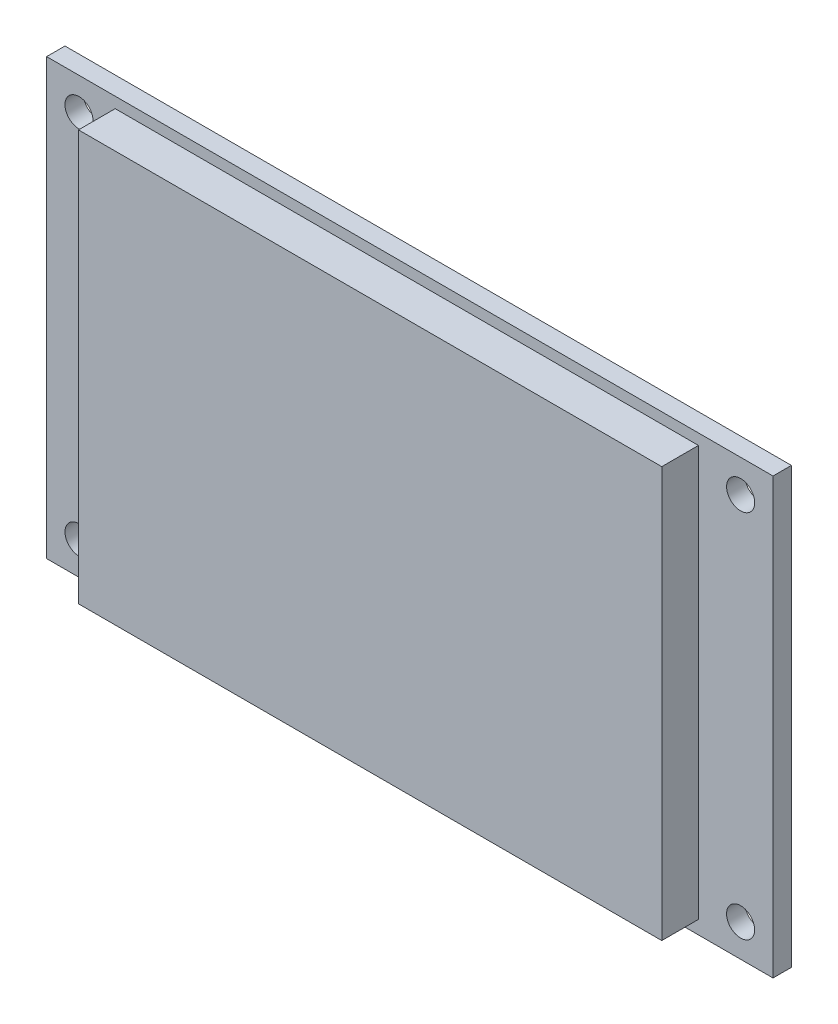
ISO-10303-21;
HEADER;
FILE_DESCRIPTION(('STEP AP214'),'2;1');
FILE_NAME('part.step','',(''),(''),'','','');
FILE_SCHEMA(('AUTOMOTIVE_DESIGN { 1 0 10303 214 1 1 1 1 }'));
ENDSEC;
DATA;
#1=APPLICATION_CONTEXT('core data for automotive mechanical design processes');
#2=APPLICATION_PROTOCOL_DEFINITION('international standard','automotive_design',2000,#1);
#3=PRODUCT_CONTEXT('',#1,'mechanical');
#4=PRODUCT('Part','Part','',(#3));
#5=PRODUCT_RELATED_PRODUCT_CATEGORY('part','',(#4));
#6=PRODUCT_DEFINITION_FORMATION('','',#4);
#7=PRODUCT_DEFINITION_CONTEXT('part definition',#1,'design');
#8=PRODUCT_DEFINITION('design','',#6,#7);
#9=PRODUCT_DEFINITION_SHAPE('','',#8);
#10=(LENGTH_UNIT() NAMED_UNIT(*) SI_UNIT(.MILLI.,.METRE.));
#11=(NAMED_UNIT(*) PLANE_ANGLE_UNIT() SI_UNIT($,.RADIAN.));
#12=(NAMED_UNIT(*) SI_UNIT($,.STERADIAN.) SOLID_ANGLE_UNIT());
#13=UNCERTAINTY_MEASURE_WITH_UNIT(LENGTH_MEASURE(1.E-05),#10,'distance_accuracy_value','');
#14=(GEOMETRIC_REPRESENTATION_CONTEXT(3) GLOBAL_UNCERTAINTY_ASSIGNED_CONTEXT((#13)) GLOBAL_UNIT_ASSIGNED_CONTEXT((#10,
#11,#12)) REPRESENTATION_CONTEXT('',''));
#15=CARTESIAN_POINT('',(0.,0.,0.));
#16=DIRECTION('',(0.,0.,1.));
#17=DIRECTION('',(1.,0.,0.));
#18=AXIS2_PLACEMENT_3D('',#15,#16,#17);
#19=CARTESIAN_POINT('',(0.,0.,1.7));
#20=DIRECTION('',(0.,0.,-1.));
#21=DIRECTION('',(-1.,0.,0.));
#22=AXIS2_PLACEMENT_3D('',#19,#20,#21);
#23=PLANE('',#22);
#24=CARTESIAN_POINT('',(-30.625,17.125,1.7));
#25=DIRECTION('',(0.,0.,1.));
#26=DIRECTION('',(1.,0.,0.));
#27=AXIS2_PLACEMENT_3D('',#24,#25,#26);
#28=CIRCLE('',#27,1.29999999999999);
#29=CARTESIAN_POINT('',(-29.325,17.125,1.7));
#30=VERTEX_POINT('',#29);
#31=EDGE_CURVE('E310',#30,#30,#28,.T.);
#32=ORIENTED_EDGE('',*,*,#31,.F.);
#33=EDGE_LOOP('',(#32));
#34=FACE_BOUND('',#33,.T.);
#35=CARTESIAN_POINT('',(-30.625,-17.125,1.7));
#36=DIRECTION('',(0.,0.,1.));
#37=DIRECTION('',(1.,0.,0.));
#38=AXIS2_PLACEMENT_3D('',#35,#36,#37);
#39=CIRCLE('',#38,1.29999999999999);
#40=CARTESIAN_POINT('',(-29.325,-17.125,1.7));
#41=VERTEX_POINT('',#40);
#42=EDGE_CURVE('E312',#41,#41,#39,.T.);
#43=ORIENTED_EDGE('',*,*,#42,.F.);
#44=EDGE_LOOP('',(#43));
#45=FACE_BOUND('',#44,.T.);
#46=CARTESIAN_POINT('',(30.625,-17.125,1.7));
#47=DIRECTION('',(0.,0.,1.));
#48=DIRECTION('',(1.,0.,0.));
#49=AXIS2_PLACEMENT_3D('',#46,#47,#48);
#50=CIRCLE('',#49,1.29999999999999);
#51=CARTESIAN_POINT('',(31.925,-17.125,1.7));
#52=VERTEX_POINT('',#51);
#53=EDGE_CURVE('E320',#52,#52,#50,.T.);
#54=ORIENTED_EDGE('',*,*,#53,.F.);
#55=EDGE_LOOP('',(#54));
#56=FACE_BOUND('',#55,.T.);
#57=CARTESIAN_POINT('',(30.625,17.125,1.7));
#58=DIRECTION('',(0.,0.,1.));
#59=DIRECTION('',(1.,0.,0.));
#60=AXIS2_PLACEMENT_3D('',#57,#58,#59);
#61=CIRCLE('',#60,1.29999999999999);
#62=CARTESIAN_POINT('',(31.925,17.125,1.7));
#63=VERTEX_POINT('',#62);
#64=EDGE_CURVE('E326',#63,#63,#61,.T.);
#65=ORIENTED_EDGE('',*,*,#64,.F.);
#66=EDGE_LOOP('',(#65));
#67=FACE_BOUND('',#66,.T.);
#68=DIRECTION('',(0.,1.,0.));
#69=VECTOR('',#68,1.);
#70=CARTESIAN_POINT('',(33.625,-20.125,1.7));
#71=LINE('',#70,#69);
#72=CARTESIAN_POINT('',(33.625,-20.125,1.7));
#73=VERTEX_POINT('',#72);
#74=CARTESIAN_POINT('',(33.625,20.125,1.7));
#75=VERTEX_POINT('',#74);
#76=EDGE_CURVE('E131',#73,#75,#71,.T.);
#77=ORIENTED_EDGE('',*,*,#76,.T.);
#78=DIRECTION('',(-1.,0.,0.));
#79=VECTOR('',#78,1.);
#80=CARTESIAN_POINT('',(-33.625,20.125,1.7));
#81=LINE('',#80,#79);
#82=CARTESIAN_POINT('',(-33.625,20.125,1.7));
#83=VERTEX_POINT('',#82);
#84=EDGE_CURVE('E134',#75,#83,#81,.T.);
#85=ORIENTED_EDGE('',*,*,#84,.T.);
#86=DIRECTION('',(0.,-1.,0.));
#87=VECTOR('',#86,1.);
#88=CARTESIAN_POINT('',(-33.625,-20.125,1.7));
#89=LINE('',#88,#87);
#90=CARTESIAN_POINT('',(-33.625,-20.125,1.7));
#91=VERTEX_POINT('',#90);
#92=EDGE_CURVE('E137',#83,#91,#89,.T.);
#93=ORIENTED_EDGE('',*,*,#92,.T.);
#94=DIRECTION('',(1.,0.,0.));
#95=VECTOR('',#94,1.);
#96=CARTESIAN_POINT('',(-33.625,-20.125,1.7));
#97=LINE('',#96,#95);
#98=EDGE_CURVE('E139',#91,#73,#97,.T.);
#99=ORIENTED_EDGE('',*,*,#98,.T.);
#100=EDGE_LOOP('',(#77,#85,#93,#99));
#101=FACE_BOUND('',#100,.T.);
#102=DIRECTION('',(0.,1.,0.));
#103=VECTOR('',#102,1.);
#104=CARTESIAN_POINT('',(26.725,-18.875,1.7));
#105=LINE('',#104,#103);
#106=CARTESIAN_POINT('',(26.725,-18.875,1.7));
#107=VERTEX_POINT('',#106);
#108=CARTESIAN_POINT('',(26.725,19.125,1.7));
#109=VERTEX_POINT('',#108);
#110=EDGE_CURVE('E52',#107,#109,#105,.T.);
#111=ORIENTED_EDGE('',*,*,#110,.F.);
#112=DIRECTION('',(1.,0.,0.));
#113=VECTOR('',#112,1.);
#114=CARTESIAN_POINT('',(-27.275,-18.875,1.7));
#115=LINE('',#114,#113);
#116=CARTESIAN_POINT('',(-27.275,-18.875,1.7));
#117=VERTEX_POINT('',#116);
#118=EDGE_CURVE('E56',#117,#107,#115,.T.);
#119=ORIENTED_EDGE('',*,*,#118,.F.);
#120=DIRECTION('',(0.,-1.,0.));
#121=VECTOR('',#120,1.);
#122=CARTESIAN_POINT('',(-27.275,-18.875,1.7));
#123=LINE('',#122,#121);
#124=CARTESIAN_POINT('',(-27.275,19.125,1.7));
#125=VERTEX_POINT('',#124);
#126=EDGE_CURVE('E338',#125,#117,#123,.T.);
#127=ORIENTED_EDGE('',*,*,#126,.F.);
#128=DIRECTION('',(-1.,0.,0.));
#129=VECTOR('',#128,1.);
#130=CARTESIAN_POINT('',(-27.275,19.125,1.7));
#131=LINE('',#130,#129);
#132=EDGE_CURVE('E336',#109,#125,#131,.T.);
#133=ORIENTED_EDGE('',*,*,#132,.F.);
#134=EDGE_LOOP('',(#111,#119,#127,#133));
#135=FACE_BOUND('',#134,.T.);
#136=ADVANCED_FACE('F37',(#34,#45,#56,#67,#101,#135),#23,.F.);
#137=CARTESIAN_POINT('',(33.625,-20.125,1.7));
#138=DIRECTION('',(-1.,0.,0.));
#139=DIRECTION('',(0.,0.,1.));
#140=AXIS2_PLACEMENT_3D('',#137,#138,#139);
#141=PLANE('',#140);
#142=DIRECTION('',(0.,1.,0.));
#143=VECTOR('',#142,1.);
#144=CARTESIAN_POINT('',(33.625,-20.125,0.));
#145=LINE('',#144,#143);
#146=CARTESIAN_POINT('',(33.625,-20.125,0.));
#147=VERTEX_POINT('',#146);
#148=CARTESIAN_POINT('',(33.625,20.125,0.));
#149=VERTEX_POINT('',#148);
#150=EDGE_CURVE('E122',#147,#149,#145,.T.);
#151=ORIENTED_EDGE('',*,*,#150,.T.);
#152=DIRECTION('',(0.,0.,-1.));
#153=VECTOR('',#152,1.);
#154=CARTESIAN_POINT('',(33.625,20.125,1.7));
#155=LINE('',#154,#153);
#156=EDGE_CURVE('E11',#75,#149,#155,.T.);
#157=ORIENTED_EDGE('',*,*,#156,.F.);
#158=ORIENTED_EDGE('',*,*,#76,.F.);
#159=DIRECTION('',(0.,0.,-1.));
#160=VECTOR('',#159,1.);
#161=CARTESIAN_POINT('',(33.625,-20.125,1.7));
#162=LINE('',#161,#160);
#163=EDGE_CURVE('E140',#73,#147,#162,.T.);
#164=ORIENTED_EDGE('',*,*,#163,.T.);
#165=EDGE_LOOP('',(#151,#157,#158,#164));
#166=FACE_BOUND('',#165,.T.);
#167=ADVANCED_FACE('F39',(#166),#141,.F.);
#168=CARTESIAN_POINT('',(-33.625,20.125,1.7));
#169=DIRECTION('',(0.,-1.,0.));
#170=DIRECTION('',(0.,0.,-1.));
#171=AXIS2_PLACEMENT_3D('',#168,#169,#170);
#172=PLANE('',#171);
#173=DIRECTION('',(-1.,0.,0.));
#174=VECTOR('',#173,1.);
#175=CARTESIAN_POINT('',(-33.625,20.125,0.));
#176=LINE('',#175,#174);
#177=CARTESIAN_POINT('',(-33.625,20.125,0.));
#178=VERTEX_POINT('',#177);
#179=EDGE_CURVE('E125',#149,#178,#176,.T.);
#180=ORIENTED_EDGE('',*,*,#179,.T.);
#181=DIRECTION('',(0.,0.,-1.));
#182=VECTOR('',#181,1.);
#183=CARTESIAN_POINT('',(-33.625,20.125,1.7));
#184=LINE('',#183,#182);
#185=EDGE_CURVE('E45',#83,#178,#184,.T.);
#186=ORIENTED_EDGE('',*,*,#185,.F.);
#187=ORIENTED_EDGE('',*,*,#84,.F.);
#188=ORIENTED_EDGE('',*,*,#156,.T.);
#189=EDGE_LOOP('',(#180,#186,#187,#188));
#190=FACE_BOUND('',#189,.T.);
#191=ADVANCED_FACE('F170',(#190),#172,.F.);
#192=CARTESIAN_POINT('',(-33.625,-20.125,1.7));
#193=DIRECTION('',(1.,0.,0.));
#194=DIRECTION('',(0.,0.,-1.));
#195=AXIS2_PLACEMENT_3D('',#192,#193,#194);
#196=PLANE('',#195);
#197=DIRECTION('',(0.,-1.,0.));
#198=VECTOR('',#197,1.);
#199=CARTESIAN_POINT('',(-33.625,-20.125,0.));
#200=LINE('',#199,#198);
#201=CARTESIAN_POINT('',(-33.625,-20.125,0.));
#202=VERTEX_POINT('',#201);
#203=EDGE_CURVE('E143',#178,#202,#200,.T.);
#204=ORIENTED_EDGE('',*,*,#203,.T.);
#205=DIRECTION('',(0.,0.,-1.));
#206=VECTOR('',#205,1.);
#207=CARTESIAN_POINT('',(-33.625,-20.125,1.7));
#208=LINE('',#207,#206);
#209=EDGE_CURVE('E148',#91,#202,#208,.T.);
#210=ORIENTED_EDGE('',*,*,#209,.F.);
#211=ORIENTED_EDGE('',*,*,#92,.F.);
#212=ORIENTED_EDGE('',*,*,#185,.T.);
#213=EDGE_LOOP('',(#204,#210,#211,#212));
#214=FACE_BOUND('',#213,.T.);
#215=ADVANCED_FACE('F155',(#214),#196,.F.);
#216=CARTESIAN_POINT('',(-33.625,-20.125,1.7));
#217=DIRECTION('',(0.,1.,0.));
#218=DIRECTION('',(0.,0.,1.));
#219=AXIS2_PLACEMENT_3D('',#216,#217,#218);
#220=PLANE('',#219);
#221=DIRECTION('',(1.,0.,0.));
#222=VECTOR('',#221,1.);
#223=CARTESIAN_POINT('',(-33.625,-20.125,0.));
#224=LINE('',#223,#222);
#225=EDGE_CURVE('E135',#202,#147,#224,.T.);
#226=ORIENTED_EDGE('',*,*,#225,.T.);
#227=ORIENTED_EDGE('',*,*,#163,.F.);
#228=ORIENTED_EDGE('',*,*,#98,.F.);
#229=ORIENTED_EDGE('',*,*,#209,.T.);
#230=EDGE_LOOP('',(#226,#227,#228,#229));
#231=FACE_BOUND('',#230,.T.);
#232=ADVANCED_FACE('F164',(#231),#220,.F.);
#233=CARTESIAN_POINT('',(0.,0.,0.));
#234=DIRECTION('',(0.,0.,-1.));
#235=DIRECTION('',(-1.,0.,0.));
#236=AXIS2_PLACEMENT_3D('',#233,#234,#235);
#237=PLANE('',#236);
#238=CARTESIAN_POINT('',(-30.625,17.125,0.));
#239=DIRECTION('',(0.,0.,1.));
#240=DIRECTION('',(1.,0.,0.));
#241=AXIS2_PLACEMENT_3D('',#238,#239,#240);
#242=CIRCLE('',#241,1.3);
#243=CARTESIAN_POINT('',(-29.325,17.125,0.));
#244=VERTEX_POINT('',#243);
#245=EDGE_CURVE('E308',#244,#244,#242,.T.);
#246=ORIENTED_EDGE('',*,*,#245,.T.);
#247=EDGE_LOOP('',(#246));
#248=FACE_BOUND('',#247,.T.);
#249=CARTESIAN_POINT('',(-30.625,-17.125,0.));
#250=DIRECTION('',(0.,0.,1.));
#251=DIRECTION('',(1.,0.,0.));
#252=AXIS2_PLACEMENT_3D('',#249,#250,#251);
#253=CIRCLE('',#252,1.3);
#254=CARTESIAN_POINT('',(-29.325,-17.125,0.));
#255=VERTEX_POINT('',#254);
#256=EDGE_CURVE('E317',#255,#255,#253,.T.);
#257=ORIENTED_EDGE('',*,*,#256,.T.);
#258=EDGE_LOOP('',(#257));
#259=FACE_BOUND('',#258,.T.);
#260=CARTESIAN_POINT('',(30.625,-17.125,0.));
#261=DIRECTION('',(0.,0.,1.));
#262=DIRECTION('',(1.,0.,0.));
#263=AXIS2_PLACEMENT_3D('',#260,#261,#262);
#264=CIRCLE('',#263,1.3);
#265=CARTESIAN_POINT('',(31.925,-17.125,0.));
#266=VERTEX_POINT('',#265);
#267=EDGE_CURVE('E323',#266,#266,#264,.T.);
#268=ORIENTED_EDGE('',*,*,#267,.T.);
#269=EDGE_LOOP('',(#268));
#270=FACE_BOUND('',#269,.T.);
#271=CARTESIAN_POINT('',(30.625,17.125,0.));
#272=DIRECTION('',(0.,0.,1.));
#273=DIRECTION('',(1.,0.,0.));
#274=AXIS2_PLACEMENT_3D('',#271,#272,#273);
#275=CIRCLE('',#274,1.3);
#276=CARTESIAN_POINT('',(31.925,17.125,0.));
#277=VERTEX_POINT('',#276);
#278=EDGE_CURVE('E329',#277,#277,#275,.T.);
#279=ORIENTED_EDGE('',*,*,#278,.T.);
#280=EDGE_LOOP('',(#279));
#281=FACE_BOUND('',#280,.T.);
#282=ORIENTED_EDGE('',*,*,#150,.F.);
#283=ORIENTED_EDGE('',*,*,#225,.F.);
#284=ORIENTED_EDGE('',*,*,#203,.F.);
#285=ORIENTED_EDGE('',*,*,#179,.F.);
#286=EDGE_LOOP('',(#282,#283,#284,#285));
#287=FACE_BOUND('',#286,.T.);
#288=ADVANCED_FACE('F161',(#248,#259,#270,#281,#287),#237,.T.);
#289=CARTESIAN_POINT('',(26.725,-18.875,5.1));
#290=DIRECTION('',(-1.,0.,0.));
#291=DIRECTION('',(0.,0.,1.));
#292=AXIS2_PLACEMENT_3D('',#289,#290,#291);
#293=PLANE('',#292);
#294=ORIENTED_EDGE('',*,*,#110,.T.);
#295=DIRECTION('',(0.,0.,-1.));
#296=VECTOR('',#295,1.);
#297=CARTESIAN_POINT('',(26.725,19.125,5.1));
#298=LINE('',#297,#296);
#299=CARTESIAN_POINT('',(26.725,19.125,5.1));
#300=VERTEX_POINT('',#299);
#301=EDGE_CURVE('E105',#300,#109,#298,.T.);
#302=ORIENTED_EDGE('',*,*,#301,.F.);
#303=DIRECTION('',(0.,1.,0.));
#304=VECTOR('',#303,1.);
#305=CARTESIAN_POINT('',(26.725,-18.875,5.1));
#306=LINE('',#305,#304);
#307=CARTESIAN_POINT('',(26.725,-18.875,5.1));
#308=VERTEX_POINT('',#307);
#309=EDGE_CURVE('E111',#308,#300,#306,.T.);
#310=ORIENTED_EDGE('',*,*,#309,.F.);
#311=DIRECTION('',(0.,0.,-1.));
#312=VECTOR('',#311,1.);
#313=CARTESIAN_POINT('',(26.725,-18.875,5.1));
#314=LINE('',#313,#312);
#315=EDGE_CURVE('E334',#308,#107,#314,.T.);
#316=ORIENTED_EDGE('',*,*,#315,.T.);
#317=EDGE_LOOP('',(#294,#302,#310,#316));
#318=FACE_BOUND('',#317,.T.);
#319=ADVANCED_FACE('F121',(#318),#293,.F.);
#320=CARTESIAN_POINT('',(-27.275,19.125,5.1));
#321=DIRECTION('',(0.,-1.,0.));
#322=DIRECTION('',(0.,0.,-1.));
#323=AXIS2_PLACEMENT_3D('',#320,#321,#322);
#324=PLANE('',#323);
#325=ORIENTED_EDGE('',*,*,#132,.T.);
#326=DIRECTION('',(0.,0.,-1.));
#327=VECTOR('',#326,1.);
#328=CARTESIAN_POINT('',(-27.275,19.125,5.1));
#329=LINE('',#328,#327);
#330=CARTESIAN_POINT('',(-27.275,19.125,5.1));
#331=VERTEX_POINT('',#330);
#332=EDGE_CURVE('E107',#331,#125,#329,.T.);
#333=ORIENTED_EDGE('',*,*,#332,.F.);
#334=DIRECTION('',(-1.,0.,0.));
#335=VECTOR('',#334,1.);
#336=CARTESIAN_POINT('',(-27.275,19.125,5.1));
#337=LINE('',#336,#335);
#338=EDGE_CURVE('E100',#300,#331,#337,.T.);
#339=ORIENTED_EDGE('',*,*,#338,.F.);
#340=ORIENTED_EDGE('',*,*,#301,.T.);
#341=EDGE_LOOP('',(#325,#333,#339,#340));
#342=FACE_BOUND('',#341,.T.);
#343=ADVANCED_FACE('F103',(#342),#324,.F.);
#344=CARTESIAN_POINT('',(-27.275,-18.875,5.1));
#345=DIRECTION('',(1.,0.,0.));
#346=DIRECTION('',(0.,0.,-1.));
#347=AXIS2_PLACEMENT_3D('',#344,#345,#346);
#348=PLANE('',#347);
#349=ORIENTED_EDGE('',*,*,#126,.T.);
#350=DIRECTION('',(0.,0.,-1.));
#351=VECTOR('',#350,1.);
#352=CARTESIAN_POINT('',(-27.275,-18.875,5.1));
#353=LINE('',#352,#351);
#354=CARTESIAN_POINT('',(-27.275,-18.875,5.1));
#355=VERTEX_POINT('',#354);
#356=EDGE_CURVE('E127',#355,#117,#353,.T.);
#357=ORIENTED_EDGE('',*,*,#356,.F.);
#358=DIRECTION('',(0.,-1.,0.));
#359=VECTOR('',#358,1.);
#360=CARTESIAN_POINT('',(-27.275,-18.875,5.1));
#361=LINE('',#360,#359);
#362=EDGE_CURVE('E110',#331,#355,#361,.T.);
#363=ORIENTED_EDGE('',*,*,#362,.F.);
#364=ORIENTED_EDGE('',*,*,#332,.T.);
#365=EDGE_LOOP('',(#349,#357,#363,#364));
#366=FACE_BOUND('',#365,.T.);
#367=ADVANCED_FACE('F211',(#366),#348,.F.);
#368=CARTESIAN_POINT('',(-27.275,-18.875,5.1));
#369=DIRECTION('',(0.,1.,0.));
#370=DIRECTION('',(0.,0.,1.));
#371=AXIS2_PLACEMENT_3D('',#368,#369,#370);
#372=PLANE('',#371);
#373=ORIENTED_EDGE('',*,*,#118,.T.);
#374=ORIENTED_EDGE('',*,*,#315,.F.);
#375=DIRECTION('',(1.,0.,0.));
#376=VECTOR('',#375,1.);
#377=CARTESIAN_POINT('',(-27.275,-18.875,5.1));
#378=LINE('',#377,#376);
#379=EDGE_CURVE('E116',#355,#308,#378,.T.);
#380=ORIENTED_EDGE('',*,*,#379,.F.);
#381=ORIENTED_EDGE('',*,*,#356,.T.);
#382=EDGE_LOOP('',(#373,#374,#380,#381));
#383=FACE_BOUND('',#382,.T.);
#384=ADVANCED_FACE('F217',(#383),#372,.F.);
#385=CARTESIAN_POINT('',(0.,0.,5.1));
#386=DIRECTION('',(0.,0.,-1.));
#387=DIRECTION('',(-1.,0.,0.));
#388=AXIS2_PLACEMENT_3D('',#385,#386,#387);
#389=PLANE('',#388);
#390=ORIENTED_EDGE('',*,*,#309,.T.);
#391=ORIENTED_EDGE('',*,*,#338,.T.);
#392=ORIENTED_EDGE('',*,*,#362,.T.);
#393=ORIENTED_EDGE('',*,*,#379,.T.);
#394=EDGE_LOOP('',(#390,#391,#392,#393));
#395=FACE_BOUND('',#394,.T.);
#396=ADVANCED_FACE('F114',(#395),#389,.F.);
#397=CARTESIAN_POINT('',(30.625,17.125,1.7));
#398=DIRECTION('',(0.,0.,1.));
#399=DIRECTION('',(1.,0.,0.));
#400=AXIS2_PLACEMENT_3D('',#397,#398,#399);
#401=CYLINDRICAL_SURFACE('',#400,1.29999999999999);
#402=ORIENTED_EDGE('',*,*,#278,.F.);
#403=EDGE_LOOP('',(#402));
#404=FACE_BOUND('',#403,.T.);
#405=ORIENTED_EDGE('',*,*,#64,.T.);
#406=EDGE_LOOP('',(#405));
#407=FACE_BOUND('',#406,.T.);
#408=ADVANCED_FACE('F232',(#404,#407),#401,.F.);
#409=CARTESIAN_POINT('',(30.625,-17.125,1.7));
#410=DIRECTION('',(0.,0.,1.));
#411=DIRECTION('',(1.,0.,0.));
#412=AXIS2_PLACEMENT_3D('',#409,#410,#411);
#413=CYLINDRICAL_SURFACE('',#412,1.29999999999999);
#414=ORIENTED_EDGE('',*,*,#267,.F.);
#415=EDGE_LOOP('',(#414));
#416=FACE_BOUND('',#415,.T.);
#417=ORIENTED_EDGE('',*,*,#53,.T.);
#418=EDGE_LOOP('',(#417));
#419=FACE_BOUND('',#418,.T.);
#420=ADVANCED_FACE('F238',(#416,#419),#413,.F.);
#421=CARTESIAN_POINT('',(-30.625,-17.125,1.7));
#422=DIRECTION('',(0.,0.,1.));
#423=DIRECTION('',(1.,0.,0.));
#424=AXIS2_PLACEMENT_3D('',#421,#422,#423);
#425=CYLINDRICAL_SURFACE('',#424,1.29999999999999);
#426=ORIENTED_EDGE('',*,*,#256,.F.);
#427=EDGE_LOOP('',(#426));
#428=FACE_BOUND('',#427,.T.);
#429=ORIENTED_EDGE('',*,*,#42,.T.);
#430=EDGE_LOOP('',(#429));
#431=FACE_BOUND('',#430,.T.);
#432=ADVANCED_FACE('F246',(#428,#431),#425,.F.);
#433=CARTESIAN_POINT('',(-30.625,17.125,1.7));
#434=DIRECTION('',(0.,0.,1.));
#435=DIRECTION('',(1.,0.,0.));
#436=AXIS2_PLACEMENT_3D('',#433,#434,#435);
#437=CYLINDRICAL_SURFACE('',#436,1.29999999999999);
#438=ORIENTED_EDGE('',*,*,#245,.F.);
#439=EDGE_LOOP('',(#438));
#440=FACE_BOUND('',#439,.T.);
#441=ORIENTED_EDGE('',*,*,#31,.T.);
#442=EDGE_LOOP('',(#441));
#443=FACE_BOUND('',#442,.T.);
#444=ADVANCED_FACE('F254',(#440,#443),#437,.F.);
#445=CLOSED_SHELL('',(#136,#167,#191,#215,#232,#288,#319,#343,#367,#384,#396,#408,#420,#432,#444));
#446=MANIFOLD_SOLID_BREP('B2',#445);
#447=ADVANCED_BREP_SHAPE_REPRESENTATION('',(#18,#446),#14);
#448=SHAPE_DEFINITION_REPRESENTATION(#9,#447);
ENDSEC;
END-ISO-10303-21;
